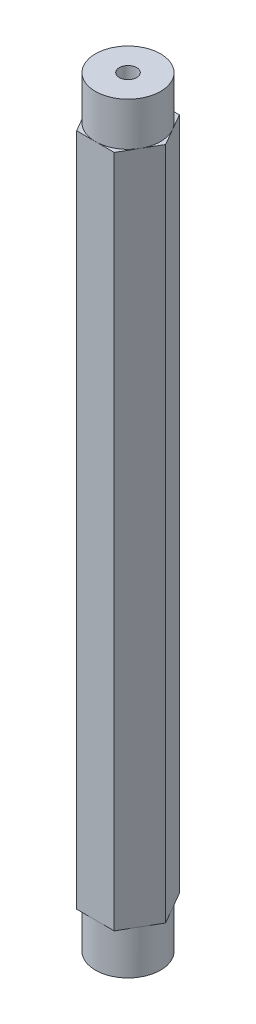
ISO-10303-21;
HEADER;
FILE_DESCRIPTION(('STEP AP214'),'2;1');
FILE_NAME('part.step','',(''),(''),'','','');
FILE_SCHEMA(('AUTOMOTIVE_DESIGN { 1 0 10303 214 1 1 1 1 }'));
ENDSEC;
DATA;
#1=APPLICATION_CONTEXT('core data for automotive mechanical design processes');
#2=APPLICATION_PROTOCOL_DEFINITION('international standard','automotive_design',2000,#1);
#3=PRODUCT_CONTEXT('',#1,'mechanical');
#4=PRODUCT('Part','Part','',(#3));
#5=PRODUCT_RELATED_PRODUCT_CATEGORY('part','',(#4));
#6=PRODUCT_DEFINITION_FORMATION('','',#4);
#7=PRODUCT_DEFINITION_CONTEXT('part definition',#1,'design');
#8=PRODUCT_DEFINITION('design','',#6,#7);
#9=PRODUCT_DEFINITION_SHAPE('','',#8);
#10=(LENGTH_UNIT() NAMED_UNIT(*) SI_UNIT(.MILLI.,.METRE.));
#11=(NAMED_UNIT(*) PLANE_ANGLE_UNIT() SI_UNIT($,.RADIAN.));
#12=(NAMED_UNIT(*) SI_UNIT($,.STERADIAN.) SOLID_ANGLE_UNIT());
#13=UNCERTAINTY_MEASURE_WITH_UNIT(LENGTH_MEASURE(1.E-05),#10,'distance_accuracy_value','');
#14=(GEOMETRIC_REPRESENTATION_CONTEXT(3) GLOBAL_UNCERTAINTY_ASSIGNED_CONTEXT((#13)) GLOBAL_UNIT_ASSIGNED_CONTEXT((#10,
#11,#12)) REPRESENTATION_CONTEXT('',''));
#15=CARTESIAN_POINT('',(0.,0.,0.));
#16=DIRECTION('',(0.,0.,1.));
#17=DIRECTION('',(1.,0.,0.));
#18=AXIS2_PLACEMENT_3D('',#15,#16,#17);
#19=CARTESIAN_POINT('',(0.,-24.638,0.));
#20=DIRECTION('',(0.,1.,0.));
#21=DIRECTION('',(0.,0.,1.));
#22=AXIS2_PLACEMENT_3D('',#19,#20,#21);
#23=PLANE('',#22);
#24=CARTESIAN_POINT('',(0.,-24.638,0.));
#25=DIRECTION('',(0.,-1.,0.));
#26=DIRECTION('',(0.,0.,-1.));
#27=AXIS2_PLACEMENT_3D('',#24,#25,#26);
#28=CIRCLE('',#27,2.38125);
#29=CARTESIAN_POINT('',(0.,-24.638,-2.38125));
#30=VERTEX_POINT('',#29);
#31=CARTESIAN_POINT('',(2.06222299276169,-24.638,-1.190625));
#32=VERTEX_POINT('',#31);
#33=EDGE_CURVE('E51',#30,#32,#28,.T.);
#34=ORIENTED_EDGE('',*,*,#33,.F.);
#35=DIRECTION('',(-1.,0.,0.));
#36=VECTOR('',#35,1.);
#37=CARTESIAN_POINT('',(1.37481532850779,-24.638,-2.38125));
#38=LINE('',#37,#36);
#39=CARTESIAN_POINT('',(1.37481532850779,-24.638,-2.38125));
#40=VERTEX_POINT('',#39);
#41=EDGE_CURVE('E132',#40,#30,#38,.T.);
#42=ORIENTED_EDGE('',*,*,#41,.F.);
#43=DIRECTION('',(-0.5,0.,-0.866025403784439));
#44=VECTOR('',#43,1.);
#45=CARTESIAN_POINT('',(2.74963065701559,-24.638,0.));
#46=LINE('',#45,#44);
#47=EDGE_CURVE('E157',#32,#40,#46,.T.);
#48=ORIENTED_EDGE('',*,*,#47,.F.);
#49=EDGE_LOOP('',(#34,#42,#48));
#50=FACE_BOUND('',#49,.T.);
#51=ADVANCED_FACE('F39',(#50),#23,.F.);
#52=CARTESIAN_POINT('',(2.06222299276169,-24.638,1.190625));
#53=VERTEX_POINT('',#52);
#54=EDGE_CURVE('E11',#32,#53,#28,.T.);
#55=ORIENTED_EDGE('',*,*,#54,.F.);
#56=CARTESIAN_POINT('',(2.74963065701559,-24.638,0.));
#57=VERTEX_POINT('',#56);
#58=EDGE_CURVE('E155',#57,#32,#46,.T.);
#59=ORIENTED_EDGE('',*,*,#58,.F.);
#60=DIRECTION('',(0.5,0.,-0.866025403784439));
#61=VECTOR('',#60,1.);
#62=CARTESIAN_POINT('',(1.3748153285078,-24.638,2.38125));
#63=LINE('',#62,#61);
#64=EDGE_CURVE('E225',#53,#57,#63,.T.);
#65=ORIENTED_EDGE('',*,*,#64,.F.);
#66=EDGE_LOOP('',(#55,#59,#65));
#67=FACE_BOUND('',#66,.T.);
#68=ADVANCED_FACE('F308',(#67),#23,.F.);
#69=CARTESIAN_POINT('',(0.,-24.638,2.38125));
#70=VERTEX_POINT('',#69);
#71=EDGE_CURVE('E49',#53,#70,#28,.T.);
#72=ORIENTED_EDGE('',*,*,#71,.F.);
#73=CARTESIAN_POINT('',(1.3748153285078,-24.638,2.38125));
#74=VERTEX_POINT('',#73);
#75=EDGE_CURVE('E226',#74,#53,#63,.T.);
#76=ORIENTED_EDGE('',*,*,#75,.F.);
#77=DIRECTION('',(1.,0.,0.));
#78=VECTOR('',#77,1.);
#79=CARTESIAN_POINT('',(-1.3748153285078,-24.638,2.38125));
#80=LINE('',#79,#78);
#81=EDGE_CURVE('E186',#70,#74,#80,.T.);
#82=ORIENTED_EDGE('',*,*,#81,.F.);
#83=EDGE_LOOP('',(#72,#76,#82));
#84=FACE_BOUND('',#83,.T.);
#85=ADVANCED_FACE('F313',(#84),#23,.F.);
#86=CARTESIAN_POINT('',(-2.0622229927617,-24.638,1.190625));
#87=VERTEX_POINT('',#86);
#88=EDGE_CURVE('E171',#70,#87,#28,.T.);
#89=ORIENTED_EDGE('',*,*,#88,.F.);
#90=CARTESIAN_POINT('',(-1.3748153285078,-24.638,2.38125));
#91=VERTEX_POINT('',#90);
#92=EDGE_CURVE('E221',#91,#70,#80,.T.);
#93=ORIENTED_EDGE('',*,*,#92,.F.);
#94=DIRECTION('',(0.5,0.,0.866025403784439));
#95=VECTOR('',#94,1.);
#96=CARTESIAN_POINT('',(-2.74963065701559,-24.638,0.));
#97=LINE('',#96,#95);
#98=EDGE_CURVE('E234',#87,#91,#97,.T.);
#99=ORIENTED_EDGE('',*,*,#98,.F.);
#100=EDGE_LOOP('',(#89,#93,#99));
#101=FACE_BOUND('',#100,.T.);
#102=ADVANCED_FACE('F328',(#101),#23,.F.);
#103=CARTESIAN_POINT('',(-2.06222299276169,-24.638,-1.190625));
#104=VERTEX_POINT('',#103);
#105=EDGE_CURVE('E166',#87,#104,#28,.T.);
#106=ORIENTED_EDGE('',*,*,#105,.F.);
#107=CARTESIAN_POINT('',(-2.74963065701559,-24.638,0.));
#108=VERTEX_POINT('',#107);
#109=EDGE_CURVE('E235',#108,#87,#97,.T.);
#110=ORIENTED_EDGE('',*,*,#109,.F.);
#111=DIRECTION('',(-0.5,0.,0.866025403784439));
#112=VECTOR('',#111,1.);
#113=CARTESIAN_POINT('',(-1.3748153285078,-24.638,-2.38125));
#114=LINE('',#113,#112);
#115=EDGE_CURVE('E144',#104,#108,#114,.T.);
#116=ORIENTED_EDGE('',*,*,#115,.F.);
#117=EDGE_LOOP('',(#106,#110,#116));
#118=FACE_BOUND('',#117,.T.);
#119=ADVANCED_FACE('F318',(#118),#23,.F.);
#120=CARTESIAN_POINT('',(0.,24.638,0.));
#121=DIRECTION('',(0.,1.,0.));
#122=DIRECTION('',(0.,0.,1.));
#123=AXIS2_PLACEMENT_3D('',#120,#121,#122);
#124=PLANE('',#123);
#125=CARTESIAN_POINT('',(0.,24.638,0.));
#126=DIRECTION('',(0.,1.,0.));
#127=DIRECTION('',(0.,0.,1.));
#128=AXIS2_PLACEMENT_3D('',#125,#126,#127);
#129=CIRCLE('',#128,2.38125);
#130=CARTESIAN_POINT('',(0.,24.638,2.38125));
#131=VERTEX_POINT('',#130);
#132=CARTESIAN_POINT('',(2.06222299276169,24.638,1.190625));
#133=VERTEX_POINT('',#132);
#134=EDGE_CURVE('E175',#131,#133,#129,.T.);
#135=ORIENTED_EDGE('',*,*,#134,.F.);
#136=DIRECTION('',(1.,0.,0.));
#137=VECTOR('',#136,1.);
#138=CARTESIAN_POINT('',(-1.3748153285078,24.638,2.38125));
#139=LINE('',#138,#137);
#140=CARTESIAN_POINT('',(1.3748153285078,24.638,2.38125));
#141=VERTEX_POINT('',#140);
#142=EDGE_CURVE('E195',#131,#141,#139,.T.);
#143=ORIENTED_EDGE('',*,*,#142,.T.);
#144=DIRECTION('',(0.5,0.,-0.866025403784439));
#145=VECTOR('',#144,1.);
#146=CARTESIAN_POINT('',(1.3748153285078,24.638,2.38125));
#147=LINE('',#146,#145);
#148=EDGE_CURVE('E196',#141,#133,#147,.T.);
#149=ORIENTED_EDGE('',*,*,#148,.T.);
#150=EDGE_LOOP('',(#135,#143,#149));
#151=FACE_BOUND('',#150,.T.);
#152=ADVANCED_FACE('F326',(#151),#124,.T.);
#153=CARTESIAN_POINT('',(2.06222299276169,24.638,-1.190625));
#154=VERTEX_POINT('',#153);
#155=EDGE_CURVE('E168',#133,#154,#129,.T.);
#156=ORIENTED_EDGE('',*,*,#155,.F.);
#157=CARTESIAN_POINT('',(2.74963065701559,24.638,0.));
#158=VERTEX_POINT('',#157);
#159=EDGE_CURVE('E194',#133,#158,#147,.T.);
#160=ORIENTED_EDGE('',*,*,#159,.T.);
#161=DIRECTION('',(-0.5,0.,-0.866025403784439));
#162=VECTOR('',#161,1.);
#163=CARTESIAN_POINT('',(2.74963065701559,24.638,0.));
#164=LINE('',#163,#162);
#165=EDGE_CURVE('E201',#158,#154,#164,.T.);
#166=ORIENTED_EDGE('',*,*,#165,.T.);
#167=EDGE_LOOP('',(#156,#160,#166));
#168=FACE_BOUND('',#167,.T.);
#169=ADVANCED_FACE('F279',(#168),#124,.T.);
#170=CARTESIAN_POINT('',(0.,24.638,-2.38125));
#171=VERTEX_POINT('',#170);
#172=EDGE_CURVE('E173',#154,#171,#129,.T.);
#173=ORIENTED_EDGE('',*,*,#172,.F.);
#174=CARTESIAN_POINT('',(1.37481532850779,24.638,-2.38125));
#175=VERTEX_POINT('',#174);
#176=EDGE_CURVE('E200',#154,#175,#164,.T.);
#177=ORIENTED_EDGE('',*,*,#176,.T.);
#178=DIRECTION('',(-1.,0.,0.));
#179=VECTOR('',#178,1.);
#180=CARTESIAN_POINT('',(1.37481532850779,24.638,-2.38125));
#181=LINE('',#180,#179);
#182=EDGE_CURVE('E206',#175,#171,#181,.T.);
#183=ORIENTED_EDGE('',*,*,#182,.T.);
#184=EDGE_LOOP('',(#173,#177,#183));
#185=FACE_BOUND('',#184,.T.);
#186=ADVANCED_FACE('F275',(#185),#124,.T.);
#187=CARTESIAN_POINT('',(-2.06222299276169,24.638,-1.190625));
#188=VERTEX_POINT('',#187);
#189=EDGE_CURVE('E267',#171,#188,#129,.T.);
#190=ORIENTED_EDGE('',*,*,#189,.F.);
#191=CARTESIAN_POINT('',(-1.3748153285078,24.638,-2.38125));
#192=VERTEX_POINT('',#191);
#193=EDGE_CURVE('E205',#171,#192,#181,.T.);
#194=ORIENTED_EDGE('',*,*,#193,.T.);
#195=DIRECTION('',(-0.5,0.,0.866025403784439));
#196=VECTOR('',#195,1.);
#197=CARTESIAN_POINT('',(-1.3748153285078,24.638,-2.38125));
#198=LINE('',#197,#196);
#199=EDGE_CURVE('E211',#192,#188,#198,.T.);
#200=ORIENTED_EDGE('',*,*,#199,.T.);
#201=EDGE_LOOP('',(#190,#194,#200));
#202=FACE_BOUND('',#201,.T.);
#203=ADVANCED_FACE('F495',(#202),#124,.T.);
#204=CARTESIAN_POINT('',(-2.0622229927617,24.638,1.190625));
#205=VERTEX_POINT('',#204);
#206=EDGE_CURVE('E263',#188,#205,#129,.T.);
#207=ORIENTED_EDGE('',*,*,#206,.F.);
#208=CARTESIAN_POINT('',(-2.74963065701559,24.638,0.));
#209=VERTEX_POINT('',#208);
#210=EDGE_CURVE('E210',#188,#209,#198,.T.);
#211=ORIENTED_EDGE('',*,*,#210,.T.);
#212=DIRECTION('',(0.5,0.,0.866025403784439));
#213=VECTOR('',#212,1.);
#214=CARTESIAN_POINT('',(-2.74963065701559,24.638,0.));
#215=LINE('',#214,#213);
#216=EDGE_CURVE('E216',#209,#205,#215,.T.);
#217=ORIENTED_EDGE('',*,*,#216,.T.);
#218=EDGE_LOOP('',(#207,#211,#217));
#219=FACE_BOUND('',#218,.T.);
#220=ADVANCED_FACE('F324',(#219),#124,.T.);
#221=EDGE_CURVE('E190',#205,#131,#129,.T.);
#222=ORIENTED_EDGE('',*,*,#221,.F.);
#223=CARTESIAN_POINT('',(-1.3748153285078,24.638,2.38125));
#224=VERTEX_POINT('',#223);
#225=EDGE_CURVE('E215',#205,#224,#215,.T.);
#226=ORIENTED_EDGE('',*,*,#225,.T.);
#227=EDGE_CURVE('E191',#224,#131,#139,.T.);
#228=ORIENTED_EDGE('',*,*,#227,.T.);
#229=EDGE_LOOP('',(#222,#226,#228));
#230=FACE_BOUND('',#229,.T.);
#231=ADVANCED_FACE('F317',(#230),#124,.T.);
#232=EDGE_CURVE('E150',#104,#30,#28,.T.);
#233=ORIENTED_EDGE('',*,*,#232,.F.);
#234=CARTESIAN_POINT('',(-1.3748153285078,-24.638,-2.38125));
#235=VERTEX_POINT('',#234);
#236=EDGE_CURVE('E153',#235,#104,#114,.T.);
#237=ORIENTED_EDGE('',*,*,#236,.F.);
#238=EDGE_CURVE('E136',#30,#235,#38,.T.);
#239=ORIENTED_EDGE('',*,*,#238,.F.);
#240=EDGE_LOOP('',(#233,#237,#239));
#241=FACE_BOUND('',#240,.T.);
#242=ADVANCED_FACE('F148',(#241),#23,.F.);
#243=CARTESIAN_POINT('',(-1.3748153285078,24.638,2.38125));
#244=DIRECTION('',(0.,0.,-1.));
#245=DIRECTION('',(-1.,0.,0.));
#246=AXIS2_PLACEMENT_3D('',#243,#244,#245);
#247=PLANE('',#246);
#248=ORIENTED_EDGE('',*,*,#92,.T.);
#249=ORIENTED_EDGE('',*,*,#81,.T.);
#250=DIRECTION('',(0.,-1.,0.));
#251=VECTOR('',#250,1.);
#252=CARTESIAN_POINT('',(1.3748153285078,24.638,2.38125));
#253=LINE('',#252,#251);
#254=EDGE_CURVE('E43',#141,#74,#253,.T.);
#255=ORIENTED_EDGE('',*,*,#254,.F.);
#256=ORIENTED_EDGE('',*,*,#142,.F.);
#257=ORIENTED_EDGE('',*,*,#227,.F.);
#258=DIRECTION('',(0.,-1.,0.));
#259=VECTOR('',#258,1.);
#260=CARTESIAN_POINT('',(-1.3748153285078,24.638,2.38125));
#261=LINE('',#260,#259);
#262=EDGE_CURVE('E220',#224,#91,#261,.T.);
#263=ORIENTED_EDGE('',*,*,#262,.T.);
#264=EDGE_LOOP('',(#248,#249,#255,#256,#257,#263));
#265=FACE_BOUND('',#264,.T.);
#266=ADVANCED_FACE('F41',(#265),#247,.F.);
#267=CARTESIAN_POINT('',(1.3748153285078,24.638,2.38125));
#268=DIRECTION('',(-0.866025403784439,0.,-0.5));
#269=DIRECTION('',(-0.5,0.,0.866025403784439));
#270=AXIS2_PLACEMENT_3D('',#267,#268,#269);
#271=PLANE('',#270);
#272=ORIENTED_EDGE('',*,*,#75,.T.);
#273=ORIENTED_EDGE('',*,*,#64,.T.);
#274=DIRECTION('',(0.,-1.,0.));
#275=VECTOR('',#274,1.);
#276=CARTESIAN_POINT('',(2.74963065701559,24.638,0.));
#277=LINE('',#276,#275);
#278=EDGE_CURVE('E250',#158,#57,#277,.T.);
#279=ORIENTED_EDGE('',*,*,#278,.F.);
#280=ORIENTED_EDGE('',*,*,#159,.F.);
#281=ORIENTED_EDGE('',*,*,#148,.F.);
#282=ORIENTED_EDGE('',*,*,#254,.T.);
#283=EDGE_LOOP('',(#272,#273,#279,#280,#281,#282));
#284=FACE_BOUND('',#283,.T.);
#285=ADVANCED_FACE('F282',(#284),#271,.F.);
#286=CARTESIAN_POINT('',(2.74963065701559,24.638,0.));
#287=DIRECTION('',(-0.866025403784439,0.,0.5));
#288=DIRECTION('',(0.5,0.,0.866025403784439));
#289=AXIS2_PLACEMENT_3D('',#286,#287,#288);
#290=PLANE('',#289);
#291=ORIENTED_EDGE('',*,*,#58,.T.);
#292=ORIENTED_EDGE('',*,*,#47,.T.);
#293=DIRECTION('',(0.,-1.,0.));
#294=VECTOR('',#293,1.);
#295=CARTESIAN_POINT('',(1.37481532850779,24.638,-2.38125));
#296=LINE('',#295,#294);
#297=EDGE_CURVE('E140',#175,#40,#296,.T.);
#298=ORIENTED_EDGE('',*,*,#297,.F.);
#299=ORIENTED_EDGE('',*,*,#176,.F.);
#300=ORIENTED_EDGE('',*,*,#165,.F.);
#301=ORIENTED_EDGE('',*,*,#278,.T.);
#302=EDGE_LOOP('',(#291,#292,#298,#299,#300,#301));
#303=FACE_BOUND('',#302,.T.);
#304=ADVANCED_FACE('F276',(#303),#290,.F.);
#305=CARTESIAN_POINT('',(1.37481532850779,24.638,-2.38125));
#306=DIRECTION('',(0.,0.,1.));
#307=DIRECTION('',(1.,0.,0.));
#308=AXIS2_PLACEMENT_3D('',#305,#306,#307);
#309=PLANE('',#308);
#310=ORIENTED_EDGE('',*,*,#41,.T.);
#311=ORIENTED_EDGE('',*,*,#238,.T.);
#312=DIRECTION('',(0.,-1.,0.));
#313=VECTOR('',#312,1.);
#314=CARTESIAN_POINT('',(-1.3748153285078,24.638,-2.38125));
#315=LINE('',#314,#313);
#316=EDGE_CURVE('E246',#192,#235,#315,.T.);
#317=ORIENTED_EDGE('',*,*,#316,.F.);
#318=ORIENTED_EDGE('',*,*,#193,.F.);
#319=ORIENTED_EDGE('',*,*,#182,.F.);
#320=ORIENTED_EDGE('',*,*,#297,.T.);
#321=EDGE_LOOP('',(#310,#311,#317,#318,#319,#320));
#322=FACE_BOUND('',#321,.T.);
#323=ADVANCED_FACE('F134',(#322),#309,.F.);
#324=CARTESIAN_POINT('',(-1.3748153285078,24.638,-2.38125));
#325=DIRECTION('',(0.866025403784439,0.,0.5));
#326=DIRECTION('',(0.5,0.,-0.866025403784439));
#327=AXIS2_PLACEMENT_3D('',#324,#325,#326);
#328=PLANE('',#327);
#329=ORIENTED_EDGE('',*,*,#236,.T.);
#330=ORIENTED_EDGE('',*,*,#115,.T.);
#331=DIRECTION('',(0.,-1.,0.));
#332=VECTOR('',#331,1.);
#333=CARTESIAN_POINT('',(-2.74963065701559,24.638,0.));
#334=LINE('',#333,#332);
#335=EDGE_CURVE('E242',#209,#108,#334,.T.);
#336=ORIENTED_EDGE('',*,*,#335,.F.);
#337=ORIENTED_EDGE('',*,*,#210,.F.);
#338=ORIENTED_EDGE('',*,*,#199,.F.);
#339=ORIENTED_EDGE('',*,*,#316,.T.);
#340=EDGE_LOOP('',(#329,#330,#336,#337,#338,#339));
#341=FACE_BOUND('',#340,.T.);
#342=ADVANCED_FACE('F350',(#341),#328,.F.);
#343=CARTESIAN_POINT('',(-2.74963065701559,24.638,0.));
#344=DIRECTION('',(0.866025403784439,0.,-0.5));
#345=DIRECTION('',(-0.5,0.,-0.866025403784439));
#346=AXIS2_PLACEMENT_3D('',#343,#344,#345);
#347=PLANE('',#346);
#348=ORIENTED_EDGE('',*,*,#109,.T.);
#349=ORIENTED_EDGE('',*,*,#98,.T.);
#350=ORIENTED_EDGE('',*,*,#262,.F.);
#351=ORIENTED_EDGE('',*,*,#225,.F.);
#352=ORIENTED_EDGE('',*,*,#216,.F.);
#353=ORIENTED_EDGE('',*,*,#335,.T.);
#354=EDGE_LOOP('',(#348,#349,#350,#351,#352,#353));
#355=FACE_BOUND('',#354,.T.);
#356=ADVANCED_FACE('F342',(#355),#347,.F.);
#357=CARTESIAN_POINT('',(0.,24.638,0.));
#358=DIRECTION('',(0.,-1.,0.));
#359=DIRECTION('',(0.,0.,-1.));
#360=AXIS2_PLACEMENT_3D('',#357,#358,#359);
#361=CYLINDRICAL_SURFACE('',#360,0.635);
#362=CARTESIAN_POINT('',(0.,27.813,0.));
#363=DIRECTION('',(0.,1.,0.));
#364=DIRECTION('',(0.,0.,1.));
#365=AXIS2_PLACEMENT_3D('',#362,#363,#364);
#366=CIRCLE('',#365,0.635);
#367=CARTESIAN_POINT('',(0.,27.813,0.635));
#368=VERTEX_POINT('',#367);
#369=EDGE_CURVE('E179',#368,#368,#366,.T.);
#370=ORIENTED_EDGE('',*,*,#369,.T.);
#371=EDGE_LOOP('',(#370));
#372=FACE_BOUND('',#371,.T.);
#373=CARTESIAN_POINT('',(0.,-27.813,0.));
#374=DIRECTION('',(0.,-1.,0.));
#375=DIRECTION('',(0.,0.,-1.));
#376=AXIS2_PLACEMENT_3D('',#373,#374,#375);
#377=CIRCLE('',#376,0.635);
#378=CARTESIAN_POINT('',(0.,-27.813,-0.635));
#379=VERTEX_POINT('',#378);
#380=EDGE_CURVE('E162',#379,#379,#377,.T.);
#381=ORIENTED_EDGE('',*,*,#380,.T.);
#382=EDGE_LOOP('',(#381));
#383=FACE_BOUND('',#382,.T.);
#384=ADVANCED_FACE('F292',(#372,#383),#361,.F.);
#385=CARTESIAN_POINT('',(0.,27.813,0.));
#386=DIRECTION('',(0.,1.,0.));
#387=DIRECTION('',(0.,0.,1.));
#388=AXIS2_PLACEMENT_3D('',#385,#386,#387);
#389=PLANE('',#388);
#390=CARTESIAN_POINT('',(0.,27.813,0.));
#391=DIRECTION('',(0.,1.,0.));
#392=DIRECTION('',(0.,0.,1.));
#393=AXIS2_PLACEMENT_3D('',#390,#391,#392);
#394=CIRCLE('',#393,2.38125);
#395=CARTESIAN_POINT('',(0.,27.813,2.38125));
#396=VERTEX_POINT('',#395);
#397=EDGE_CURVE('E183',#396,#396,#394,.T.);
#398=ORIENTED_EDGE('',*,*,#397,.T.);
#399=EDGE_LOOP('',(#398));
#400=FACE_BOUND('',#399,.T.);
#401=ORIENTED_EDGE('',*,*,#369,.F.);
#402=EDGE_LOOP('',(#401));
#403=FACE_BOUND('',#402,.T.);
#404=ADVANCED_FACE('F304',(#400,#403),#389,.T.);
#405=CARTESIAN_POINT('',(0.,27.813,0.));
#406=DIRECTION('',(0.,-1.,0.));
#407=DIRECTION('',(0.,0.,-1.));
#408=AXIS2_PLACEMENT_3D('',#405,#406,#407);
#409=CYLINDRICAL_SURFACE('',#408,2.38125);
#410=ORIENTED_EDGE('',*,*,#397,.F.);
#411=EDGE_LOOP('',(#410));
#412=FACE_BOUND('',#411,.T.);
#413=ORIENTED_EDGE('',*,*,#134,.T.);
#414=ORIENTED_EDGE('',*,*,#155,.T.);
#415=ORIENTED_EDGE('',*,*,#172,.T.);
#416=ORIENTED_EDGE('',*,*,#189,.T.);
#417=ORIENTED_EDGE('',*,*,#206,.T.);
#418=ORIENTED_EDGE('',*,*,#221,.T.);
#419=EDGE_LOOP('',(#413,#414,#415,#416,#417,#418));
#420=FACE_BOUND('',#419,.T.);
#421=ADVANCED_FACE('F272',(#412,#420),#409,.T.);
#422=CARTESIAN_POINT('',(0.,-27.813,0.));
#423=DIRECTION('',(0.,-1.,0.));
#424=DIRECTION('',(0.,0.,-1.));
#425=AXIS2_PLACEMENT_3D('',#422,#423,#424);
#426=PLANE('',#425);
#427=CARTESIAN_POINT('',(0.,-27.813,0.));
#428=DIRECTION('',(0.,-1.,0.));
#429=DIRECTION('',(0.,0.,-1.));
#430=AXIS2_PLACEMENT_3D('',#427,#428,#429);
#431=CIRCLE('',#430,2.38125);
#432=CARTESIAN_POINT('',(0.,-27.813,-2.38125));
#433=VERTEX_POINT('',#432);
#434=EDGE_CURVE('E161',#433,#433,#431,.T.);
#435=ORIENTED_EDGE('',*,*,#434,.T.);
#436=EDGE_LOOP('',(#435));
#437=FACE_BOUND('',#436,.T.);
#438=ORIENTED_EDGE('',*,*,#380,.F.);
#439=EDGE_LOOP('',(#438));
#440=FACE_BOUND('',#439,.T.);
#441=ADVANCED_FACE('F294',(#437,#440),#426,.T.);
#442=CARTESIAN_POINT('',(0.,-27.813,0.));
#443=DIRECTION('',(0.,1.,0.));
#444=DIRECTION('',(0.,0.,1.));
#445=AXIS2_PLACEMENT_3D('',#442,#443,#444);
#446=CYLINDRICAL_SURFACE('',#445,2.38125);
#447=ORIENTED_EDGE('',*,*,#434,.F.);
#448=EDGE_LOOP('',(#447));
#449=FACE_BOUND('',#448,.T.);
#450=ORIENTED_EDGE('',*,*,#33,.T.);
#451=ORIENTED_EDGE('',*,*,#54,.T.);
#452=ORIENTED_EDGE('',*,*,#71,.T.);
#453=ORIENTED_EDGE('',*,*,#88,.T.);
#454=ORIENTED_EDGE('',*,*,#105,.T.);
#455=ORIENTED_EDGE('',*,*,#232,.T.);
#456=EDGE_LOOP('',(#450,#451,#452,#453,#454,#455));
#457=FACE_BOUND('',#456,.T.);
#458=ADVANCED_FACE('F164',(#449,#457),#446,.T.);
#459=CLOSED_SHELL('',(#51,#68,#85,#102,#119,#152,#169,#186,#203,#220,#231,#242,#266,#285,#304,
#323,#342,#356,#384,#404,#421,#441,#458));
#460=MANIFOLD_SOLID_BREP('B2',#459);
#461=ADVANCED_BREP_SHAPE_REPRESENTATION('',(#18,#460),#14);
#462=SHAPE_DEFINITION_REPRESENTATION(#9,#461);
ENDSEC;
END-ISO-10303-21;
